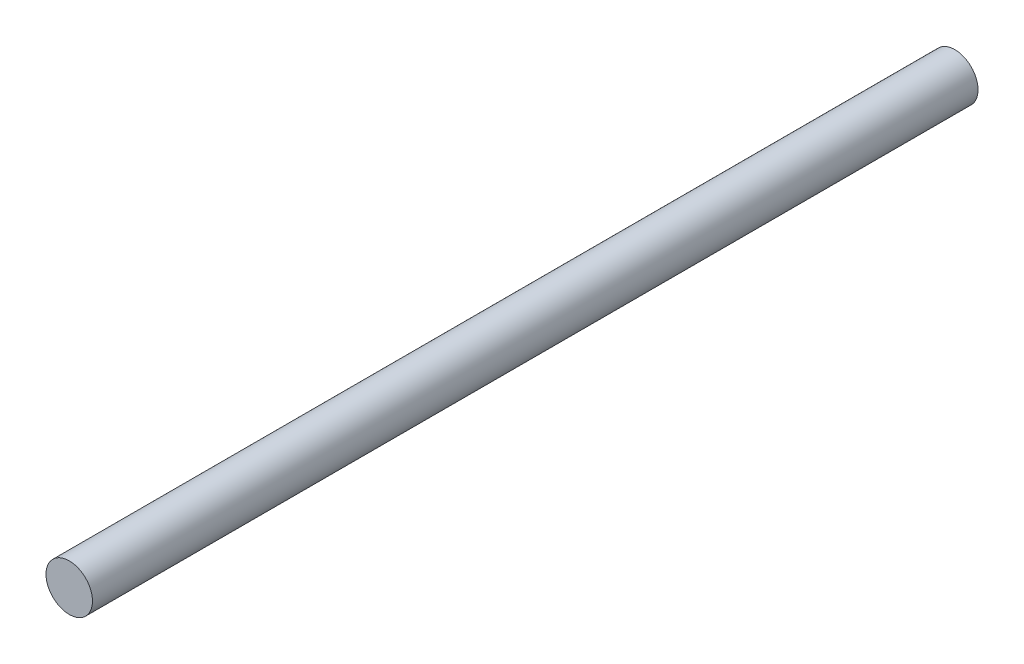
ISO-10303-21;
HEADER;
FILE_DESCRIPTION(('STEP AP214'),'2;1');
FILE_NAME('part.step','',(''),(''),'','','');
FILE_SCHEMA(('AUTOMOTIVE_DESIGN { 1 0 10303 214 1 1 1 1 }'));
ENDSEC;
DATA;
#1=APPLICATION_CONTEXT('core data for automotive mechanical design processes');
#2=APPLICATION_PROTOCOL_DEFINITION('international standard','automotive_design',2000,#1);
#3=PRODUCT_CONTEXT('',#1,'mechanical');
#4=PRODUCT('Part','Part','',(#3));
#5=PRODUCT_RELATED_PRODUCT_CATEGORY('part','',(#4));
#6=PRODUCT_DEFINITION_FORMATION('','',#4);
#7=PRODUCT_DEFINITION_CONTEXT('part definition',#1,'design');
#8=PRODUCT_DEFINITION('design','',#6,#7);
#9=PRODUCT_DEFINITION_SHAPE('','',#8);
#10=(LENGTH_UNIT() NAMED_UNIT(*) SI_UNIT(.MILLI.,.METRE.));
#11=(NAMED_UNIT(*) PLANE_ANGLE_UNIT() SI_UNIT($,.RADIAN.));
#12=(NAMED_UNIT(*) SI_UNIT($,.STERADIAN.) SOLID_ANGLE_UNIT());
#13=UNCERTAINTY_MEASURE_WITH_UNIT(LENGTH_MEASURE(1.E-05),#10,'distance_accuracy_value','');
#14=(GEOMETRIC_REPRESENTATION_CONTEXT(3) GLOBAL_UNCERTAINTY_ASSIGNED_CONTEXT((#13)) GLOBAL_UNIT_ASSIGNED_CONTEXT((#10,
#11,#12)) REPRESENTATION_CONTEXT('',''));
#15=CARTESIAN_POINT('',(0.,0.,0.));
#16=DIRECTION('',(0.,0.,1.));
#17=DIRECTION('',(1.,0.,0.));
#18=AXIS2_PLACEMENT_3D('',#15,#16,#17);
#19=CARTESIAN_POINT('',(0.,0.,152.4));
#20=DIRECTION('',(0.,0.,-1.));
#21=DIRECTION('',(-1.,0.,0.));
#22=AXIS2_PLACEMENT_3D('',#19,#20,#21);
#23=CYLINDRICAL_SURFACE('',#22,4.);
#24=CARTESIAN_POINT('',(0.,0.,152.4));
#25=DIRECTION('',(0.,0.,1.));
#26=DIRECTION('',(1.,0.,0.));
#27=AXIS2_PLACEMENT_3D('',#24,#25,#26);
#28=CIRCLE('',#27,4.);
#29=CARTESIAN_POINT('',(-4.,0.,152.4));
#30=VERTEX_POINT('',#29);
#31=EDGE_CURVE('E10',#30,#30,#28,.T.);
#32=CARTESIAN_POINT('',(0.,0.,0.));
#33=DIRECTION('',(0.,0.,1.));
#34=DIRECTION('',(1.,0.,0.));
#35=AXIS2_PLACEMENT_3D('',#32,#33,#34);
#36=CIRCLE('',#35,4.);
#37=CARTESIAN_POINT('',(-4.,0.,0.));
#38=VERTEX_POINT('',#37);
#39=EDGE_CURVE('E40',#38,#38,#36,.T.);
#40=CARTESIAN_POINT('',(-4.,0.,152.4));
#41=CARTESIAN_POINT('',(-4.,0.,150.8125));
#42=CARTESIAN_POINT('',(-4.,0.,149.225));
#43=CARTESIAN_POINT('',(-4.,0.,146.05));
#44=CARTESIAN_POINT('',(-4.,0.,144.4625));
#45=CARTESIAN_POINT('',(-4.,0.,141.2875));
#46=CARTESIAN_POINT('',(-4.,0.,139.7));
#47=CARTESIAN_POINT('',(-4.,0.,136.525));
#48=CARTESIAN_POINT('',(-4.,0.,134.9375));
#49=CARTESIAN_POINT('',(-4.,0.,131.7625));
#50=CARTESIAN_POINT('',(-4.,0.,130.175));
#51=CARTESIAN_POINT('',(-4.,0.,127.));
#52=CARTESIAN_POINT('',(-4.,0.,125.4125));
#53=CARTESIAN_POINT('',(-4.,0.,122.2375));
#54=CARTESIAN_POINT('',(-4.,0.,120.65));
#55=CARTESIAN_POINT('',(-4.,0.,117.475));
#56=CARTESIAN_POINT('',(-4.,0.,115.8875));
#57=CARTESIAN_POINT('',(-4.,0.,112.7125));
#58=CARTESIAN_POINT('',(-4.,0.,111.125));
#59=CARTESIAN_POINT('',(-4.,0.,107.95));
#60=CARTESIAN_POINT('',(-4.,0.,106.3625));
#61=CARTESIAN_POINT('',(-4.,0.,103.1875));
#62=CARTESIAN_POINT('',(-4.,0.,101.6));
#63=CARTESIAN_POINT('',(-4.,0.,98.425));
#64=CARTESIAN_POINT('',(-4.,0.,96.8375));
#65=CARTESIAN_POINT('',(-4.,0.,93.6625));
#66=CARTESIAN_POINT('',(-4.,0.,92.075));
#67=CARTESIAN_POINT('',(-4.,0.,88.9));
#68=CARTESIAN_POINT('',(-4.,0.,87.3125));
#69=CARTESIAN_POINT('',(-4.,0.,84.1375));
#70=CARTESIAN_POINT('',(-4.,0.,82.55));
#71=CARTESIAN_POINT('',(-4.,0.,79.375));
#72=CARTESIAN_POINT('',(-4.,0.,77.7875));
#73=CARTESIAN_POINT('',(-4.,0.,74.6125));
#74=CARTESIAN_POINT('',(-4.,0.,73.025));
#75=CARTESIAN_POINT('',(-4.,0.,69.85));
#76=CARTESIAN_POINT('',(-4.,0.,68.2625));
#77=CARTESIAN_POINT('',(-4.,0.,65.0875));
#78=CARTESIAN_POINT('',(-4.,0.,63.5));
#79=CARTESIAN_POINT('',(-4.,0.,60.325));
#80=CARTESIAN_POINT('',(-4.,0.,58.7375));
#81=CARTESIAN_POINT('',(-4.,0.,55.5625));
#82=CARTESIAN_POINT('',(-4.,0.,53.975));
#83=CARTESIAN_POINT('',(-4.,0.,50.8));
#84=CARTESIAN_POINT('',(-4.,0.,49.2125));
#85=CARTESIAN_POINT('',(-4.,0.,46.0375));
#86=CARTESIAN_POINT('',(-4.,0.,44.45));
#87=CARTESIAN_POINT('',(-4.,0.,41.275));
#88=CARTESIAN_POINT('',(-4.,0.,39.6875));
#89=CARTESIAN_POINT('',(-4.,0.,36.5125));
#90=CARTESIAN_POINT('',(-4.,0.,34.925));
#91=CARTESIAN_POINT('',(-4.,0.,31.75));
#92=CARTESIAN_POINT('',(-4.,0.,30.1625));
#93=CARTESIAN_POINT('',(-4.,0.,26.9875));
#94=CARTESIAN_POINT('',(-4.,0.,25.4));
#95=CARTESIAN_POINT('',(-4.,0.,22.225));
#96=CARTESIAN_POINT('',(-4.,0.,20.6375));
#97=CARTESIAN_POINT('',(-4.,0.,17.4625));
#98=CARTESIAN_POINT('',(-4.,0.,15.875));
#99=CARTESIAN_POINT('',(-4.,0.,12.7));
#100=CARTESIAN_POINT('',(-4.,0.,11.1125));
#101=CARTESIAN_POINT('',(-4.,0.,7.93750000000001));
#102=CARTESIAN_POINT('',(-4.,0.,6.35));
#103=CARTESIAN_POINT('',(-4.,0.,3.175));
#104=CARTESIAN_POINT('',(-4.,0.,1.5875));
#105=CARTESIAN_POINT('',(-4.,0.,0.));
#106=B_SPLINE_CURVE_WITH_KNOTS('',3,(#40,#41,#42,#43,#44,#45,#46,#47,#48,#49,#50,#51,#52,#53,
#54,#55,#56,#57,#58,#59,#60,#61,#62,#63,#64,#65,#66,#67,#68,#69,#70,#71,#72,#73,#74,#75,#76,#77,
#78,#79,#80,#81,#82,#83,#84,#85,#86,#87,#88,#89,#90,#91,#92,#93,#94,#95,#96,#97,#98,#99,#100,
#101,#102,#103,#104,#105),.UNSPECIFIED.,.F.,.F.,(4,2,2,2,2,2,2,2,2,2,2,2,2,2,2,2,2,2,2,2,2,2,2,
2,2,2,2,2,2,2,2,2,4),(0.,4.7625,9.52500000000001,14.2875,19.05,23.8125,28.575,33.3375,38.1,
42.8625,47.625,52.3875,57.15,61.9125,66.675,71.4375,76.2,80.9625,85.725,90.4875,95.25,100.0125,
104.775,109.5375,114.3,119.0625,123.825,128.5875,133.35,138.1125,142.875,147.6375,152.4),.UNSPECIFIED.);
#107=EDGE_CURVE('BSEAM37',#30,#38,#106,.T.);
#108=ORIENTED_EDGE('',*,*,#31,.F.);
#109=ORIENTED_EDGE('',*,*,#39,.T.);
#110=ORIENTED_EDGE('',*,*,#107,.T.);
#111=ORIENTED_EDGE('',*,*,#107,.F.);
#112=EDGE_LOOP('',(#108,#110,#109,#111));
#113=FACE_BOUND('',#112,.T.);
#114=ADVANCED_FACE('F37',(#113),#23,.T.);
#115=CARTESIAN_POINT('',(0.,0.,152.4));
#116=DIRECTION('',(0.,0.,1.));
#117=DIRECTION('',(1.,0.,0.));
#118=AXIS2_PLACEMENT_3D('',#115,#116,#117);
#119=PLANE('',#118);
#120=ORIENTED_EDGE('',*,*,#31,.T.);
#121=EDGE_LOOP('',(#120));
#122=FACE_BOUND('',#121,.T.);
#123=ADVANCED_FACE('F54',(#122),#119,.T.);
#124=CARTESIAN_POINT('',(0.,0.,0.));
#125=DIRECTION('',(0.,0.,1.));
#126=DIRECTION('',(1.,0.,0.));
#127=AXIS2_PLACEMENT_3D('',#124,#125,#126);
#128=PLANE('',#127);
#129=ORIENTED_EDGE('',*,*,#39,.F.);
#130=EDGE_LOOP('',(#129));
#131=FACE_BOUND('',#130,.T.);
#132=ADVANCED_FACE('F52',(#131),#128,.F.);
#133=CLOSED_SHELL('',(#114,#123,#132));
#134=MANIFOLD_SOLID_BREP('B2',#133);
#135=ADVANCED_BREP_SHAPE_REPRESENTATION('',(#18,#134),#14);
#136=SHAPE_DEFINITION_REPRESENTATION(#9,#135);
ENDSEC;
END-ISO-10303-21;
